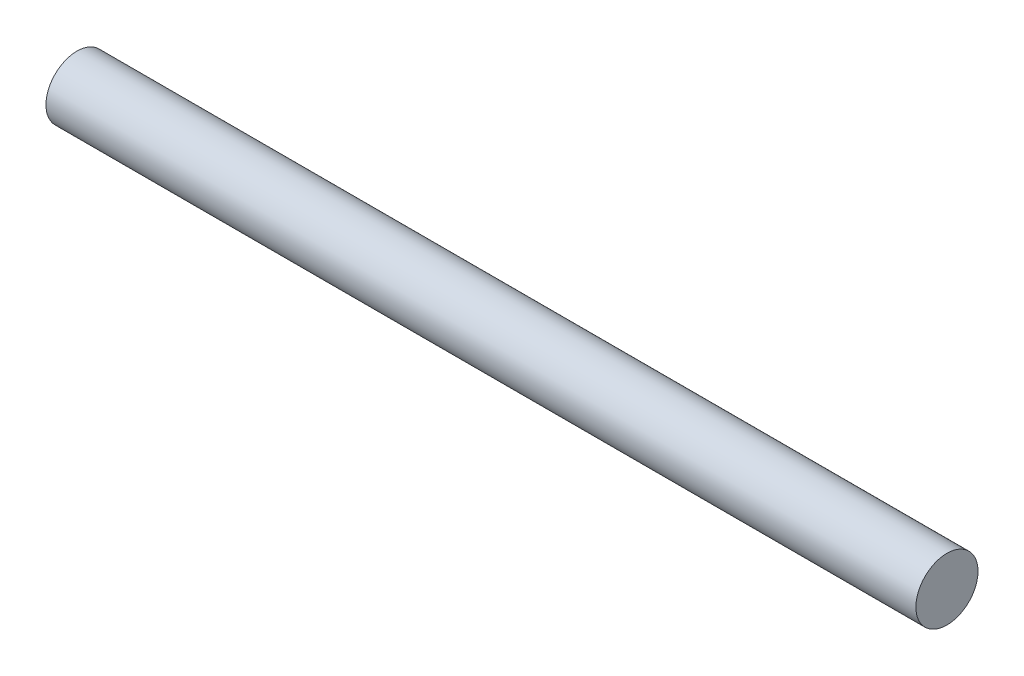
ISO-10303-21;
HEADER;
FILE_DESCRIPTION(('STEP AP214'),'2;1');
FILE_NAME('part.step','',(''),(''),'','','');
FILE_SCHEMA(('AUTOMOTIVE_DESIGN { 1 0 10303 214 1 1 1 1 }'));
ENDSEC;
DATA;
#1=APPLICATION_CONTEXT('core data for automotive mechanical design processes');
#2=APPLICATION_PROTOCOL_DEFINITION('international standard','automotive_design',2000,#1);
#3=PRODUCT_CONTEXT('',#1,'mechanical');
#4=PRODUCT('Part','Part','',(#3));
#5=PRODUCT_RELATED_PRODUCT_CATEGORY('part','',(#4));
#6=PRODUCT_DEFINITION_FORMATION('','',#4);
#7=PRODUCT_DEFINITION_CONTEXT('part definition',#1,'design');
#8=PRODUCT_DEFINITION('design','',#6,#7);
#9=PRODUCT_DEFINITION_SHAPE('','',#8);
#10=(LENGTH_UNIT() NAMED_UNIT(*) SI_UNIT(.MILLI.,.METRE.));
#11=(NAMED_UNIT(*) PLANE_ANGLE_UNIT() SI_UNIT($,.RADIAN.));
#12=(NAMED_UNIT(*) SI_UNIT($,.STERADIAN.) SOLID_ANGLE_UNIT());
#13=UNCERTAINTY_MEASURE_WITH_UNIT(LENGTH_MEASURE(1.E-05),#10,'distance_accuracy_value','');
#14=(GEOMETRIC_REPRESENTATION_CONTEXT(3) GLOBAL_UNCERTAINTY_ASSIGNED_CONTEXT((#13)) GLOBAL_UNIT_ASSIGNED_CONTEXT((#10,
#11,#12)) REPRESENTATION_CONTEXT('',''));
#15=CARTESIAN_POINT('',(0.,0.,0.));
#16=DIRECTION('',(0.,0.,1.));
#17=DIRECTION('',(1.,0.,0.));
#18=AXIS2_PLACEMENT_3D('',#15,#16,#17);
#19=CARTESIAN_POINT('',(210.,0.,0.));
#20=DIRECTION('',(-1.,0.,0.));
#21=DIRECTION('',(0.,0.,1.));
#22=AXIS2_PLACEMENT_3D('',#19,#20,#21);
#23=CYLINDRICAL_SURFACE('',#22,7.5);
#24=CARTESIAN_POINT('',(210.,0.,0.));
#25=DIRECTION('',(1.,0.,0.));
#26=DIRECTION('',(0.,0.,-1.));
#27=AXIS2_PLACEMENT_3D('',#24,#25,#26);
#28=CIRCLE('',#27,7.5);
#29=CARTESIAN_POINT('',(210.,0.,-7.5));
#30=VERTEX_POINT('',#29);
#31=EDGE_CURVE('E10',#30,#30,#28,.T.);
#32=ORIENTED_EDGE('',*,*,#31,.F.);
#33=EDGE_LOOP('',(#32));
#34=FACE_BOUND('',#33,.T.);
#35=CARTESIAN_POINT('',(0.,0.,0.));
#36=DIRECTION('',(1.,0.,0.));
#37=DIRECTION('',(0.,0.,-1.));
#38=AXIS2_PLACEMENT_3D('',#35,#36,#37);
#39=CIRCLE('',#38,7.5);
#40=CARTESIAN_POINT('',(0.,0.,-7.5));
#41=VERTEX_POINT('',#40);
#42=EDGE_CURVE('E40',#41,#41,#39,.T.);
#43=ORIENTED_EDGE('',*,*,#42,.T.);
#44=EDGE_LOOP('',(#43));
#45=FACE_BOUND('',#44,.T.);
#46=ADVANCED_FACE('F37',(#34,#45),#23,.T.);
#47=CARTESIAN_POINT('',(210.,0.,0.));
#48=DIRECTION('',(1.,0.,0.));
#49=DIRECTION('',(0.,0.,-1.));
#50=AXIS2_PLACEMENT_3D('',#47,#48,#49);
#51=PLANE('',#50);
#52=ORIENTED_EDGE('',*,*,#31,.T.);
#53=EDGE_LOOP('',(#52));
#54=FACE_BOUND('',#53,.T.);
#55=ADVANCED_FACE('F52',(#54),#51,.T.);
#56=CARTESIAN_POINT('',(0.,0.,0.));
#57=DIRECTION('',(1.,0.,0.));
#58=DIRECTION('',(0.,0.,-1.));
#59=AXIS2_PLACEMENT_3D('',#56,#57,#58);
#60=PLANE('',#59);
#61=ORIENTED_EDGE('',*,*,#42,.F.);
#62=EDGE_LOOP('',(#61));
#63=FACE_BOUND('',#62,.T.);
#64=ADVANCED_FACE('F50',(#63),#60,.F.);
#65=CLOSED_SHELL('',(#46,#55,#64));
#66=MANIFOLD_SOLID_BREP('B2',#65);
#67=ADVANCED_BREP_SHAPE_REPRESENTATION('',(#18,#66),#14);
#68=SHAPE_DEFINITION_REPRESENTATION(#9,#67);
ENDSEC;
END-ISO-10303-21;
